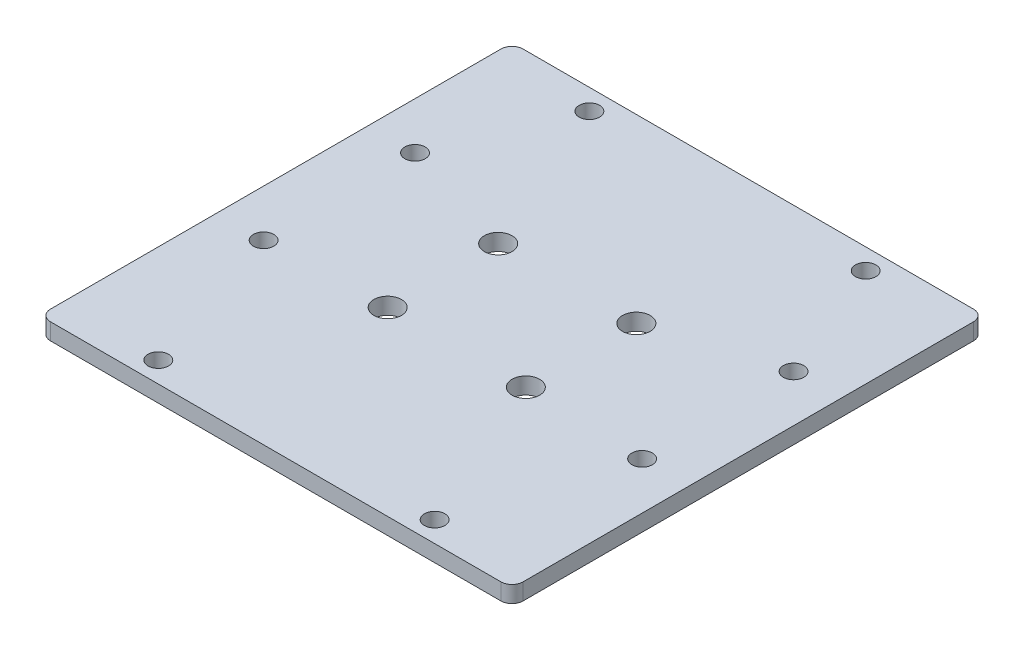
ISO-10303-21;
HEADER;
FILE_DESCRIPTION(('STEP AP214'),'2;1');
FILE_NAME('part.step','',(''),(''),'','','');
FILE_SCHEMA(('AUTOMOTIVE_DESIGN { 1 0 10303 214 1 1 1 1 }'));
ENDSEC;
DATA;
#1=APPLICATION_CONTEXT('core data for automotive mechanical design processes');
#2=APPLICATION_PROTOCOL_DEFINITION('international standard','automotive_design',2000,#1);
#3=PRODUCT_CONTEXT('',#1,'mechanical');
#4=PRODUCT('Part','Part','',(#3));
#5=PRODUCT_RELATED_PRODUCT_CATEGORY('part','',(#4));
#6=PRODUCT_DEFINITION_FORMATION('','',#4);
#7=PRODUCT_DEFINITION_CONTEXT('part definition',#1,'design');
#8=PRODUCT_DEFINITION('design','',#6,#7);
#9=PRODUCT_DEFINITION_SHAPE('','',#8);
#10=(LENGTH_UNIT() NAMED_UNIT(*) SI_UNIT(.MILLI.,.METRE.));
#11=(NAMED_UNIT(*) PLANE_ANGLE_UNIT() SI_UNIT($,.RADIAN.));
#12=(NAMED_UNIT(*) SI_UNIT($,.STERADIAN.) SOLID_ANGLE_UNIT());
#13=UNCERTAINTY_MEASURE_WITH_UNIT(LENGTH_MEASURE(1.E-05),#10,'distance_accuracy_value','');
#14=(GEOMETRIC_REPRESENTATION_CONTEXT(3) GLOBAL_UNCERTAINTY_ASSIGNED_CONTEXT((#13)) GLOBAL_UNIT_ASSIGNED_CONTEXT((#10,
#11,#12)) REPRESENTATION_CONTEXT('',''));
#15=CARTESIAN_POINT('',(0.,0.,0.));
#16=DIRECTION('',(0.,0.,1.));
#17=DIRECTION('',(1.,0.,0.));
#18=AXIS2_PLACEMENT_3D('',#15,#16,#17);
#19=CARTESIAN_POINT('',(-42.75,3.,42.75));
#20=DIRECTION('',(1.,0.,0.));
#21=DIRECTION('',(0.,0.,-1.));
#22=AXIS2_PLACEMENT_3D('',#19,#20,#21);
#23=PLANE('',#22);
#24=DIRECTION('',(0.,0.,1.));
#25=VECTOR('',#24,1.);
#26=CARTESIAN_POINT('',(-42.75,3.,42.75));
#27=LINE('',#26,#25);
#28=CARTESIAN_POINT('',(-42.75,3.,-40.75));
#29=VERTEX_POINT('',#28);
#30=CARTESIAN_POINT('',(-42.75,3.,40.75));
#31=VERTEX_POINT('',#30);
#32=EDGE_CURVE('E124',#29,#31,#27,.T.);
#33=ORIENTED_EDGE('',*,*,#32,.F.);
#34=DIRECTION('',(0.,-1.,0.));
#35=VECTOR('',#34,1.);
#36=CARTESIAN_POINT('',(-42.75,3.,-40.75));
#37=LINE('',#36,#35);
#38=CARTESIAN_POINT('',(-42.75,0.,-40.75));
#39=VERTEX_POINT('',#38);
#40=EDGE_CURVE('E109',#29,#39,#37,.T.);
#41=ORIENTED_EDGE('',*,*,#40,.T.);
#42=DIRECTION('',(0.,0.,1.));
#43=VECTOR('',#42,1.);
#44=CARTESIAN_POINT('',(-42.75,0.,42.75));
#45=LINE('',#44,#43);
#46=CARTESIAN_POINT('',(-42.75,0.,40.75));
#47=VERTEX_POINT('',#46);
#48=EDGE_CURVE('E121',#39,#47,#45,.T.);
#49=ORIENTED_EDGE('',*,*,#48,.T.);
#50=DIRECTION('',(0.,-1.,0.));
#51=VECTOR('',#50,1.);
#52=CARTESIAN_POINT('',(-42.75,3.,40.75));
#53=LINE('',#52,#51);
#54=EDGE_CURVE('E126',#47,#31,#53,.F.);
#55=ORIENTED_EDGE('',*,*,#54,.T.);
#56=EDGE_LOOP('',(#33,#41,#49,#55));
#57=FACE_BOUND('',#56,.T.);
#58=ADVANCED_FACE('F36',(#57),#23,.F.);
#59=CARTESIAN_POINT('',(42.75,3.,42.75));
#60=DIRECTION('',(0.,0.,-1.));
#61=DIRECTION('',(-1.,0.,0.));
#62=AXIS2_PLACEMENT_3D('',#59,#60,#61);
#63=PLANE('',#62);
#64=DIRECTION('',(1.,0.,0.));
#65=VECTOR('',#64,1.);
#66=CARTESIAN_POINT('',(42.75,3.,42.75));
#67=LINE('',#66,#65);
#68=CARTESIAN_POINT('',(-40.75,3.,42.75));
#69=VERTEX_POINT('',#68);
#70=CARTESIAN_POINT('',(40.75,3.,42.75));
#71=VERTEX_POINT('',#70);
#72=EDGE_CURVE('E214',#69,#71,#67,.T.);
#73=ORIENTED_EDGE('',*,*,#72,.F.);
#74=DIRECTION('',(0.,-1.,0.));
#75=VECTOR('',#74,1.);
#76=CARTESIAN_POINT('',(-40.75,3.,42.75));
#77=LINE('',#76,#75);
#78=CARTESIAN_POINT('',(-40.75,0.,42.75));
#79=VERTEX_POINT('',#78);
#80=EDGE_CURVE('E11',#69,#79,#77,.T.);
#81=ORIENTED_EDGE('',*,*,#80,.T.);
#82=DIRECTION('',(1.,0.,0.));
#83=VECTOR('',#82,1.);
#84=CARTESIAN_POINT('',(42.75,0.,42.75));
#85=LINE('',#84,#83);
#86=CARTESIAN_POINT('',(40.75,0.,42.75));
#87=VERTEX_POINT('',#86);
#88=EDGE_CURVE('E131',#79,#87,#85,.T.);
#89=ORIENTED_EDGE('',*,*,#88,.T.);
#90=DIRECTION('',(0.,-1.,0.));
#91=VECTOR('',#90,1.);
#92=CARTESIAN_POINT('',(40.75,3.,42.75));
#93=LINE('',#92,#91);
#94=EDGE_CURVE('E45',#87,#71,#93,.F.);
#95=ORIENTED_EDGE('',*,*,#94,.T.);
#96=EDGE_LOOP('',(#73,#81,#89,#95));
#97=FACE_BOUND('',#96,.T.);
#98=ADVANCED_FACE('F232',(#97),#63,.F.);
#99=CARTESIAN_POINT('',(42.75,3.,42.75));
#100=DIRECTION('',(-1.,0.,0.));
#101=DIRECTION('',(0.,0.,1.));
#102=AXIS2_PLACEMENT_3D('',#99,#100,#101);
#103=PLANE('',#102);
#104=DIRECTION('',(0.,0.,-1.));
#105=VECTOR('',#104,1.);
#106=CARTESIAN_POINT('',(42.75,0.,42.75));
#107=LINE('',#106,#105);
#108=CARTESIAN_POINT('',(42.75,0.,40.75));
#109=VERTEX_POINT('',#108);
#110=CARTESIAN_POINT('',(42.75,0.,-40.75));
#111=VERTEX_POINT('',#110);
#112=EDGE_CURVE('E135',#109,#111,#107,.T.);
#113=ORIENTED_EDGE('',*,*,#112,.T.);
#114=DIRECTION('',(0.,-1.,0.));
#115=VECTOR('',#114,1.);
#116=CARTESIAN_POINT('',(42.75,3.,-40.75));
#117=LINE('',#116,#115);
#118=CARTESIAN_POINT('',(42.75,3.,-40.75));
#119=VERTEX_POINT('',#118);
#120=EDGE_CURVE('E53',#111,#119,#117,.F.);
#121=ORIENTED_EDGE('',*,*,#120,.T.);
#122=DIRECTION('',(0.,0.,-1.));
#123=VECTOR('',#122,1.);
#124=CARTESIAN_POINT('',(42.75,3.,42.75));
#125=LINE('',#124,#123);
#126=CARTESIAN_POINT('',(42.75,3.,40.75));
#127=VERTEX_POINT('',#126);
#128=EDGE_CURVE('E215',#127,#119,#125,.T.);
#129=ORIENTED_EDGE('',*,*,#128,.F.);
#130=DIRECTION('',(0.,-1.,0.));
#131=VECTOR('',#130,1.);
#132=CARTESIAN_POINT('',(42.75,3.,40.75));
#133=LINE('',#132,#131);
#134=EDGE_CURVE('E161',#127,#109,#133,.T.);
#135=ORIENTED_EDGE('',*,*,#134,.T.);
#136=EDGE_LOOP('',(#113,#121,#129,#135));
#137=FACE_BOUND('',#136,.T.);
#138=ADVANCED_FACE('F226',(#137),#103,.F.);
#139=CARTESIAN_POINT('',(42.75,3.,-42.75));
#140=DIRECTION('',(0.,0.,1.));
#141=DIRECTION('',(1.,0.,0.));
#142=AXIS2_PLACEMENT_3D('',#139,#140,#141);
#143=PLANE('',#142);
#144=DIRECTION('',(-1.,0.,0.));
#145=VECTOR('',#144,1.);
#146=CARTESIAN_POINT('',(42.75,0.,-42.75));
#147=LINE('',#146,#145);
#148=CARTESIAN_POINT('',(40.75,0.,-42.75));
#149=VERTEX_POINT('',#148);
#150=CARTESIAN_POINT('',(-40.75,0.,-42.75));
#151=VERTEX_POINT('',#150);
#152=EDGE_CURVE('E145',#149,#151,#147,.T.);
#153=ORIENTED_EDGE('',*,*,#152,.T.);
#154=DIRECTION('',(0.,-1.,0.));
#155=VECTOR('',#154,1.);
#156=CARTESIAN_POINT('',(-40.75,3.,-42.75));
#157=LINE('',#156,#155);
#158=CARTESIAN_POINT('',(-40.75,3.,-42.75));
#159=VERTEX_POINT('',#158);
#160=EDGE_CURVE('E110',#151,#159,#157,.F.);
#161=ORIENTED_EDGE('',*,*,#160,.T.);
#162=DIRECTION('',(-1.,0.,0.));
#163=VECTOR('',#162,1.);
#164=CARTESIAN_POINT('',(42.75,3.,-42.75));
#165=LINE('',#164,#163);
#166=CARTESIAN_POINT('',(40.75,3.,-42.75));
#167=VERTEX_POINT('',#166);
#168=EDGE_CURVE('E141',#167,#159,#165,.T.);
#169=ORIENTED_EDGE('',*,*,#168,.F.);
#170=DIRECTION('',(0.,-1.,0.));
#171=VECTOR('',#170,1.);
#172=CARTESIAN_POINT('',(40.75,3.,-42.75));
#173=LINE('',#172,#171);
#174=EDGE_CURVE('E115',#167,#149,#173,.T.);
#175=ORIENTED_EDGE('',*,*,#174,.T.);
#176=EDGE_LOOP('',(#153,#161,#169,#175));
#177=FACE_BOUND('',#176,.T.);
#178=ADVANCED_FACE('F222',(#177),#143,.F.);
#179=CARTESIAN_POINT('',(0.,3.,0.));
#180=DIRECTION('',(0.,1.,0.));
#181=DIRECTION('',(0.,0.,1.));
#182=AXIS2_PLACEMENT_3D('',#179,#180,#181);
#183=PLANE('',#182);
#184=CARTESIAN_POINT('',(-12.5,3.,-10.));
#185=DIRECTION('',(0.,1.,0.));
#186=DIRECTION('',(0.,0.,1.));
#187=AXIS2_PLACEMENT_3D('',#184,#185,#186);
#188=CIRCLE('',#187,2.5);
#189=CARTESIAN_POINT('',(-12.5,3.,-7.5));
#190=VERTEX_POINT('',#189);
#191=EDGE_CURVE('E493',#190,#190,#188,.T.);
#192=ORIENTED_EDGE('',*,*,#191,.F.);
#193=EDGE_LOOP('',(#192));
#194=FACE_BOUND('',#193,.T.);
#195=CARTESIAN_POINT('',(-12.5,3.,10.));
#196=DIRECTION('',(0.,1.,0.));
#197=DIRECTION('',(0.,0.,1.));
#198=AXIS2_PLACEMENT_3D('',#195,#196,#197);
#199=CIRCLE('',#198,2.5);
#200=CARTESIAN_POINT('',(-12.5,3.,12.5));
#201=VERTEX_POINT('',#200);
#202=EDGE_CURVE('E501',#201,#201,#199,.T.);
#203=ORIENTED_EDGE('',*,*,#202,.F.);
#204=EDGE_LOOP('',(#203));
#205=FACE_BOUND('',#204,.T.);
#206=CARTESIAN_POINT('',(12.5,3.,-10.));
#207=DIRECTION('',(0.,1.,0.));
#208=DIRECTION('',(0.,0.,1.));
#209=AXIS2_PLACEMENT_3D('',#206,#207,#208);
#210=CIRCLE('',#209,2.5);
#211=CARTESIAN_POINT('',(12.5,3.,-7.5));
#212=VERTEX_POINT('',#211);
#213=EDGE_CURVE('E497',#212,#212,#210,.T.);
#214=ORIENTED_EDGE('',*,*,#213,.F.);
#215=EDGE_LOOP('',(#214));
#216=FACE_BOUND('',#215,.T.);
#217=CARTESIAN_POINT('',(12.5,3.,10.));
#218=DIRECTION('',(0.,1.,0.));
#219=DIRECTION('',(0.,0.,1.));
#220=AXIS2_PLACEMENT_3D('',#217,#218,#219);
#221=CIRCLE('',#220,2.5);
#222=CARTESIAN_POINT('',(12.5,3.,12.5));
#223=VERTEX_POINT('',#222);
#224=EDGE_CURVE('E494',#223,#223,#221,.T.);
#225=ORIENTED_EDGE('',*,*,#224,.F.);
#226=EDGE_LOOP('',(#225));
#227=FACE_BOUND('',#226,.T.);
#228=CARTESIAN_POINT('',(-34.25,3.,10.7));
#229=DIRECTION('',(0.,1.,0.));
#230=DIRECTION('',(0.,0.,1.));
#231=AXIS2_PLACEMENT_3D('',#228,#229,#230);
#232=CIRCLE('',#231,1.85);
#233=CARTESIAN_POINT('',(-34.25,3.,12.55));
#234=VERTEX_POINT('',#233);
#235=EDGE_CURVE('E498',#234,#234,#232,.T.);
#236=ORIENTED_EDGE('',*,*,#235,.F.);
#237=EDGE_LOOP('',(#236));
#238=FACE_BOUND('',#237,.T.);
#239=CARTESIAN_POINT('',(34.2499999999999,3.,10.7));
#240=DIRECTION('',(0.,1.,0.));
#241=DIRECTION('',(0.,0.,1.));
#242=AXIS2_PLACEMENT_3D('',#239,#240,#241);
#243=CIRCLE('',#242,1.85);
#244=CARTESIAN_POINT('',(34.2499999999999,3.,12.55));
#245=VERTEX_POINT('',#244);
#246=EDGE_CURVE('E509',#245,#245,#243,.T.);
#247=ORIENTED_EDGE('',*,*,#246,.F.);
#248=EDGE_LOOP('',(#247));
#249=FACE_BOUND('',#248,.T.);
#250=CARTESIAN_POINT('',(34.2499999999999,3.,-16.7));
#251=DIRECTION('',(0.,1.,0.));
#252=DIRECTION('',(0.,0.,1.));
#253=AXIS2_PLACEMENT_3D('',#250,#251,#252);
#254=CIRCLE('',#253,1.85);
#255=CARTESIAN_POINT('',(34.2499999999999,3.,-14.85));
#256=VERTEX_POINT('',#255);
#257=EDGE_CURVE('E506',#256,#256,#254,.T.);
#258=ORIENTED_EDGE('',*,*,#257,.F.);
#259=EDGE_LOOP('',(#258));
#260=FACE_BOUND('',#259,.T.);
#261=CARTESIAN_POINT('',(-34.25,3.,-16.7));
#262=DIRECTION('',(0.,1.,0.));
#263=DIRECTION('',(0.,0.,1.));
#264=AXIS2_PLACEMENT_3D('',#261,#262,#263);
#265=CIRCLE('',#264,1.85);
#266=CARTESIAN_POINT('',(-34.25,3.,-14.85));
#267=VERTEX_POINT('',#266);
#268=EDGE_CURVE('E179',#267,#267,#265,.T.);
#269=ORIENTED_EDGE('',*,*,#268,.F.);
#270=EDGE_LOOP('',(#269));
#271=FACE_BOUND('',#270,.T.);
#272=CARTESIAN_POINT('',(-25.,3.,39.));
#273=DIRECTION('',(0.,1.,0.));
#274=DIRECTION('',(0.,0.,1.));
#275=AXIS2_PLACEMENT_3D('',#272,#273,#274);
#276=CIRCLE('',#275,1.85);
#277=CARTESIAN_POINT('',(-25.,3.,40.85));
#278=VERTEX_POINT('',#277);
#279=EDGE_CURVE('E198',#278,#278,#276,.T.);
#280=ORIENTED_EDGE('',*,*,#279,.F.);
#281=EDGE_LOOP('',(#280));
#282=FACE_BOUND('',#281,.T.);
#283=CARTESIAN_POINT('',(25.,3.,39.));
#284=DIRECTION('',(0.,1.,0.));
#285=DIRECTION('',(0.,0.,1.));
#286=AXIS2_PLACEMENT_3D('',#283,#284,#285);
#287=CIRCLE('',#286,1.85);
#288=CARTESIAN_POINT('',(25.,3.,40.85));
#289=VERTEX_POINT('',#288);
#290=EDGE_CURVE('E202',#289,#289,#287,.T.);
#291=ORIENTED_EDGE('',*,*,#290,.F.);
#292=EDGE_LOOP('',(#291));
#293=FACE_BOUND('',#292,.T.);
#294=CARTESIAN_POINT('',(25.,3.,-39.));
#295=DIRECTION('',(0.,1.,0.));
#296=DIRECTION('',(0.,0.,1.));
#297=AXIS2_PLACEMENT_3D('',#294,#295,#296);
#298=CIRCLE('',#297,1.85);
#299=CARTESIAN_POINT('',(25.,3.,-37.15));
#300=VERTEX_POINT('',#299);
#301=EDGE_CURVE('E207',#300,#300,#298,.T.);
#302=ORIENTED_EDGE('',*,*,#301,.F.);
#303=EDGE_LOOP('',(#302));
#304=FACE_BOUND('',#303,.T.);
#305=CARTESIAN_POINT('',(-25.,3.,-39.));
#306=DIRECTION('',(0.,1.,0.));
#307=DIRECTION('',(0.,0.,1.));
#308=AXIS2_PLACEMENT_3D('',#305,#306,#307);
#309=CIRCLE('',#308,1.85);
#310=CARTESIAN_POINT('',(-25.,3.,-37.15));
#311=VERTEX_POINT('',#310);
#312=EDGE_CURVE('E170',#311,#311,#309,.T.);
#313=ORIENTED_EDGE('',*,*,#312,.F.);
#314=EDGE_LOOP('',(#313));
#315=FACE_BOUND('',#314,.T.);
#316=ORIENTED_EDGE('',*,*,#168,.T.);
#317=CARTESIAN_POINT('',(-40.75,3.,-40.75));
#318=DIRECTION('',(0.,1.,0.));
#319=DIRECTION('',(0.,0.,1.));
#320=AXIS2_PLACEMENT_3D('',#317,#318,#319);
#321=CIRCLE('',#320,2.);
#322=EDGE_CURVE('E159',#159,#29,#321,.T.);
#323=ORIENTED_EDGE('',*,*,#322,.T.);
#324=ORIENTED_EDGE('',*,*,#32,.T.);
#325=CARTESIAN_POINT('',(-40.75,3.,40.75));
#326=DIRECTION('',(0.,1.,0.));
#327=DIRECTION('',(0.,0.,1.));
#328=AXIS2_PLACEMENT_3D('',#325,#326,#327);
#329=CIRCLE('',#328,2.);
#330=EDGE_CURVE('E155',#31,#69,#329,.T.);
#331=ORIENTED_EDGE('',*,*,#330,.T.);
#332=ORIENTED_EDGE('',*,*,#72,.T.);
#333=CARTESIAN_POINT('',(40.75,3.,40.75));
#334=DIRECTION('',(0.,1.,0.));
#335=DIRECTION('',(0.,0.,1.));
#336=AXIS2_PLACEMENT_3D('',#333,#334,#335);
#337=CIRCLE('',#336,2.);
#338=EDGE_CURVE('E60',#71,#127,#337,.T.);
#339=ORIENTED_EDGE('',*,*,#338,.T.);
#340=ORIENTED_EDGE('',*,*,#128,.T.);
#341=CARTESIAN_POINT('',(40.75,3.,-40.75));
#342=DIRECTION('',(0.,1.,0.));
#343=DIRECTION('',(0.,0.,1.));
#344=AXIS2_PLACEMENT_3D('',#341,#342,#343);
#345=CIRCLE('',#344,2.);
#346=EDGE_CURVE('E157',#119,#167,#345,.T.);
#347=ORIENTED_EDGE('',*,*,#346,.T.);
#348=EDGE_LOOP('',(#316,#323,#324,#331,#332,#339,#340,#347));
#349=FACE_BOUND('',#348,.T.);
#350=ADVANCED_FACE('F219',(#194,#205,#216,#227,#238,#249,#260,#271,#282,#293,#304,#315,#349),
#183,.T.);
#351=CARTESIAN_POINT('',(0.,0.,0.));
#352=DIRECTION('',(0.,1.,0.));
#353=DIRECTION('',(0.,0.,1.));
#354=AXIS2_PLACEMENT_3D('',#351,#352,#353);
#355=PLANE('',#354);
#356=CARTESIAN_POINT('',(-12.5,0.,-10.));
#357=DIRECTION('',(0.,1.,0.));
#358=DIRECTION('',(0.,0.,1.));
#359=AXIS2_PLACEMENT_3D('',#356,#357,#358);
#360=CIRCLE('',#359,2.5);
#361=CARTESIAN_POINT('',(-12.5,0.,-7.5));
#362=VERTEX_POINT('',#361);
#363=EDGE_CURVE('E40',#362,#362,#360,.T.);
#364=ORIENTED_EDGE('',*,*,#363,.T.);
#365=EDGE_LOOP('',(#364));
#366=FACE_BOUND('',#365,.T.);
#367=CARTESIAN_POINT('',(-12.5,0.,10.));
#368=DIRECTION('',(0.,1.,0.));
#369=DIRECTION('',(0.,0.,1.));
#370=AXIS2_PLACEMENT_3D('',#367,#368,#369);
#371=CIRCLE('',#370,2.5);
#372=CARTESIAN_POINT('',(-12.5,0.,12.5));
#373=VERTEX_POINT('',#372);
#374=EDGE_CURVE('E193',#373,#373,#371,.T.);
#375=ORIENTED_EDGE('',*,*,#374,.T.);
#376=EDGE_LOOP('',(#375));
#377=FACE_BOUND('',#376,.T.);
#378=CARTESIAN_POINT('',(12.5,0.,-10.));
#379=DIRECTION('',(0.,1.,0.));
#380=DIRECTION('',(0.,0.,1.));
#381=AXIS2_PLACEMENT_3D('',#378,#379,#380);
#382=CIRCLE('',#381,2.5);
#383=CARTESIAN_POINT('',(12.5,0.,-7.5));
#384=VERTEX_POINT('',#383);
#385=EDGE_CURVE('E191',#384,#384,#382,.T.);
#386=ORIENTED_EDGE('',*,*,#385,.T.);
#387=EDGE_LOOP('',(#386));
#388=FACE_BOUND('',#387,.T.);
#389=CARTESIAN_POINT('',(12.5,0.,10.));
#390=DIRECTION('',(0.,1.,0.));
#391=DIRECTION('',(0.,0.,1.));
#392=AXIS2_PLACEMENT_3D('',#389,#390,#391);
#393=CIRCLE('',#392,2.5);
#394=CARTESIAN_POINT('',(12.5,0.,12.5));
#395=VERTEX_POINT('',#394);
#396=EDGE_CURVE('E188',#395,#395,#393,.T.);
#397=ORIENTED_EDGE('',*,*,#396,.T.);
#398=EDGE_LOOP('',(#397));
#399=FACE_BOUND('',#398,.T.);
#400=CARTESIAN_POINT('',(-34.25,0.,10.7));
#401=DIRECTION('',(0.,1.,0.));
#402=DIRECTION('',(0.,0.,1.));
#403=AXIS2_PLACEMENT_3D('',#400,#401,#402);
#404=CIRCLE('',#403,1.85);
#405=CARTESIAN_POINT('',(-34.25,0.,12.55));
#406=VERTEX_POINT('',#405);
#407=EDGE_CURVE('E185',#406,#406,#404,.T.);
#408=ORIENTED_EDGE('',*,*,#407,.T.);
#409=EDGE_LOOP('',(#408));
#410=FACE_BOUND('',#409,.T.);
#411=CARTESIAN_POINT('',(34.2499999999999,0.,10.7));
#412=DIRECTION('',(0.,1.,0.));
#413=DIRECTION('',(0.,0.,1.));
#414=AXIS2_PLACEMENT_3D('',#411,#412,#413);
#415=CIRCLE('',#414,1.85);
#416=CARTESIAN_POINT('',(34.2499999999999,0.,12.55));
#417=VERTEX_POINT('',#416);
#418=EDGE_CURVE('E182',#417,#417,#415,.T.);
#419=ORIENTED_EDGE('',*,*,#418,.T.);
#420=EDGE_LOOP('',(#419));
#421=FACE_BOUND('',#420,.T.);
#422=CARTESIAN_POINT('',(34.2499999999999,0.,-16.7));
#423=DIRECTION('',(0.,1.,0.));
#424=DIRECTION('',(0.,0.,1.));
#425=AXIS2_PLACEMENT_3D('',#422,#423,#424);
#426=CIRCLE('',#425,1.85);
#427=CARTESIAN_POINT('',(34.2499999999999,0.,-14.85));
#428=VERTEX_POINT('',#427);
#429=EDGE_CURVE('E178',#428,#428,#426,.T.);
#430=ORIENTED_EDGE('',*,*,#429,.T.);
#431=EDGE_LOOP('',(#430));
#432=FACE_BOUND('',#431,.T.);
#433=CARTESIAN_POINT('',(-34.25,0.,-16.7));
#434=DIRECTION('',(0.,1.,0.));
#435=DIRECTION('',(0.,0.,1.));
#436=AXIS2_PLACEMENT_3D('',#433,#434,#435);
#437=CIRCLE('',#436,1.85);
#438=CARTESIAN_POINT('',(-34.25,0.,-14.85));
#439=VERTEX_POINT('',#438);
#440=EDGE_CURVE('E175',#439,#439,#437,.T.);
#441=ORIENTED_EDGE('',*,*,#440,.T.);
#442=EDGE_LOOP('',(#441));
#443=FACE_BOUND('',#442,.T.);
#444=CARTESIAN_POINT('',(-25.,0.,39.));
#445=DIRECTION('',(0.,1.,0.));
#446=DIRECTION('',(0.,0.,1.));
#447=AXIS2_PLACEMENT_3D('',#444,#445,#446);
#448=CIRCLE('',#447,1.85);
#449=CARTESIAN_POINT('',(-25.,0.,40.85));
#450=VERTEX_POINT('',#449);
#451=EDGE_CURVE('E132',#450,#450,#448,.T.);
#452=ORIENTED_EDGE('',*,*,#451,.T.);
#453=EDGE_LOOP('',(#452));
#454=FACE_BOUND('',#453,.T.);
#455=CARTESIAN_POINT('',(25.,0.,39.));
#456=DIRECTION('',(0.,1.,0.));
#457=DIRECTION('',(0.,0.,1.));
#458=AXIS2_PLACEMENT_3D('',#455,#456,#457);
#459=CIRCLE('',#458,1.85);
#460=CARTESIAN_POINT('',(25.,0.,40.85));
#461=VERTEX_POINT('',#460);
#462=EDGE_CURVE('E138',#461,#461,#459,.T.);
#463=ORIENTED_EDGE('',*,*,#462,.T.);
#464=EDGE_LOOP('',(#463));
#465=FACE_BOUND('',#464,.T.);
#466=CARTESIAN_POINT('',(25.,0.,-39.));
#467=DIRECTION('',(0.,1.,0.));
#468=DIRECTION('',(0.,0.,1.));
#469=AXIS2_PLACEMENT_3D('',#466,#467,#468);
#470=CIRCLE('',#469,1.85);
#471=CARTESIAN_POINT('',(25.,0.,-37.15));
#472=VERTEX_POINT('',#471);
#473=EDGE_CURVE('E169',#472,#472,#470,.T.);
#474=ORIENTED_EDGE('',*,*,#473,.T.);
#475=EDGE_LOOP('',(#474));
#476=FACE_BOUND('',#475,.T.);
#477=CARTESIAN_POINT('',(-25.,0.,-39.));
#478=DIRECTION('',(0.,1.,0.));
#479=DIRECTION('',(0.,0.,1.));
#480=AXIS2_PLACEMENT_3D('',#477,#478,#479);
#481=CIRCLE('',#480,1.85);
#482=CARTESIAN_POINT('',(-25.,0.,-37.15));
#483=VERTEX_POINT('',#482);
#484=EDGE_CURVE('E166',#483,#483,#481,.T.);
#485=ORIENTED_EDGE('',*,*,#484,.T.);
#486=EDGE_LOOP('',(#485));
#487=FACE_BOUND('',#486,.T.);
#488=ORIENTED_EDGE('',*,*,#48,.F.);
#489=CARTESIAN_POINT('',(-40.75,0.,-40.75));
#490=DIRECTION('',(0.,1.,0.));
#491=DIRECTION('',(0.,0.,1.));
#492=AXIS2_PLACEMENT_3D('',#489,#490,#491);
#493=CIRCLE('',#492,2.);
#494=EDGE_CURVE('E105',#39,#151,#493,.F.);
#495=ORIENTED_EDGE('',*,*,#494,.T.);
#496=ORIENTED_EDGE('',*,*,#152,.F.);
#497=CARTESIAN_POINT('',(40.75,0.,-40.75));
#498=DIRECTION('',(0.,1.,0.));
#499=DIRECTION('',(0.,0.,1.));
#500=AXIS2_PLACEMENT_3D('',#497,#498,#499);
#501=CIRCLE('',#500,2.);
#502=EDGE_CURVE('E116',#149,#111,#501,.F.);
#503=ORIENTED_EDGE('',*,*,#502,.T.);
#504=ORIENTED_EDGE('',*,*,#112,.F.);
#505=CARTESIAN_POINT('',(40.75,0.,40.75));
#506=DIRECTION('',(0.,1.,0.));
#507=DIRECTION('',(0.,0.,1.));
#508=AXIS2_PLACEMENT_3D('',#505,#506,#507);
#509=CIRCLE('',#508,2.);
#510=EDGE_CURVE('E125',#109,#87,#509,.F.);
#511=ORIENTED_EDGE('',*,*,#510,.T.);
#512=ORIENTED_EDGE('',*,*,#88,.F.);
#513=CARTESIAN_POINT('',(-40.75,0.,40.75));
#514=DIRECTION('',(0.,1.,0.));
#515=DIRECTION('',(0.,0.,1.));
#516=AXIS2_PLACEMENT_3D('',#513,#514,#515);
#517=CIRCLE('',#516,2.);
#518=EDGE_CURVE('E130',#79,#47,#517,.F.);
#519=ORIENTED_EDGE('',*,*,#518,.T.);
#520=EDGE_LOOP('',(#488,#495,#496,#503,#504,#511,#512,#519));
#521=FACE_BOUND('',#520,.T.);
#522=ADVANCED_FACE('F128',(#366,#377,#388,#399,#410,#421,#432,#443,#454,#465,#476,#487,#521),
#355,.F.);
#523=CARTESIAN_POINT('',(-40.75,3.,-40.75));
#524=DIRECTION('',(0.,-1.,0.));
#525=DIRECTION('',(0.,0.,-1.));
#526=AXIS2_PLACEMENT_3D('',#523,#524,#525);
#527=CYLINDRICAL_SURFACE('',#526,2.);
#528=ORIENTED_EDGE('',*,*,#322,.F.);
#529=ORIENTED_EDGE('',*,*,#160,.F.);
#530=ORIENTED_EDGE('',*,*,#494,.F.);
#531=ORIENTED_EDGE('',*,*,#40,.F.);
#532=EDGE_LOOP('',(#528,#529,#530,#531));
#533=FACE_BOUND('',#532,.T.);
#534=ADVANCED_FACE('F108',(#533),#527,.T.);
#535=CARTESIAN_POINT('',(40.75,3.,-40.75));
#536=DIRECTION('',(0.,-1.,0.));
#537=DIRECTION('',(0.,0.,-1.));
#538=AXIS2_PLACEMENT_3D('',#535,#536,#537);
#539=CYLINDRICAL_SURFACE('',#538,2.);
#540=ORIENTED_EDGE('',*,*,#346,.F.);
#541=ORIENTED_EDGE('',*,*,#120,.F.);
#542=ORIENTED_EDGE('',*,*,#502,.F.);
#543=ORIENTED_EDGE('',*,*,#174,.F.);
#544=EDGE_LOOP('',(#540,#541,#542,#543));
#545=FACE_BOUND('',#544,.T.);
#546=ADVANCED_FACE('F224',(#545),#539,.T.);
#547=CARTESIAN_POINT('',(-40.75,3.,40.75));
#548=DIRECTION('',(0.,-1.,0.));
#549=DIRECTION('',(0.,0.,-1.));
#550=AXIS2_PLACEMENT_3D('',#547,#548,#549);
#551=CYLINDRICAL_SURFACE('',#550,2.);
#552=ORIENTED_EDGE('',*,*,#330,.F.);
#553=ORIENTED_EDGE('',*,*,#54,.F.);
#554=ORIENTED_EDGE('',*,*,#518,.F.);
#555=ORIENTED_EDGE('',*,*,#80,.F.);
#556=EDGE_LOOP('',(#552,#553,#554,#555));
#557=FACE_BOUND('',#556,.T.);
#558=ADVANCED_FACE('F236',(#557),#551,.T.);
#559=CARTESIAN_POINT('',(40.75,3.,40.75));
#560=DIRECTION('',(0.,-1.,0.));
#561=DIRECTION('',(0.,0.,-1.));
#562=AXIS2_PLACEMENT_3D('',#559,#560,#561);
#563=CYLINDRICAL_SURFACE('',#562,2.);
#564=ORIENTED_EDGE('',*,*,#338,.F.);
#565=ORIENTED_EDGE('',*,*,#94,.F.);
#566=ORIENTED_EDGE('',*,*,#510,.F.);
#567=ORIENTED_EDGE('',*,*,#134,.F.);
#568=EDGE_LOOP('',(#564,#565,#566,#567));
#569=FACE_BOUND('',#568,.T.);
#570=ADVANCED_FACE('F38',(#569),#563,.T.);
#571=CARTESIAN_POINT('',(-25.,-7.,-39.));
#572=DIRECTION('',(0.,1.,0.));
#573=DIRECTION('',(0.,0.,1.));
#574=AXIS2_PLACEMENT_3D('',#571,#572,#573);
#575=CYLINDRICAL_SURFACE('',#574,1.85);
#576=ORIENTED_EDGE('',*,*,#312,.T.);
#577=EDGE_LOOP('',(#576));
#578=FACE_BOUND('',#577,.T.);
#579=ORIENTED_EDGE('',*,*,#484,.F.);
#580=EDGE_LOOP('',(#579));
#581=FACE_BOUND('',#580,.T.);
#582=ADVANCED_FACE('F242',(#578,#581),#575,.F.);
#583=CARTESIAN_POINT('',(25.,-7.,-39.));
#584=DIRECTION('',(0.,1.,0.));
#585=DIRECTION('',(0.,0.,1.));
#586=AXIS2_PLACEMENT_3D('',#583,#584,#585);
#587=CYLINDRICAL_SURFACE('',#586,1.85);
#588=ORIENTED_EDGE('',*,*,#301,.T.);
#589=EDGE_LOOP('',(#588));
#590=FACE_BOUND('',#589,.T.);
#591=ORIENTED_EDGE('',*,*,#473,.F.);
#592=EDGE_LOOP('',(#591));
#593=FACE_BOUND('',#592,.T.);
#594=ADVANCED_FACE('F402',(#590,#593),#587,.F.);
#595=CARTESIAN_POINT('',(25.,-7.,39.));
#596=DIRECTION('',(0.,1.,0.));
#597=DIRECTION('',(0.,0.,1.));
#598=AXIS2_PLACEMENT_3D('',#595,#596,#597);
#599=CYLINDRICAL_SURFACE('',#598,1.85);
#600=ORIENTED_EDGE('',*,*,#290,.T.);
#601=EDGE_LOOP('',(#600));
#602=FACE_BOUND('',#601,.T.);
#603=ORIENTED_EDGE('',*,*,#462,.F.);
#604=EDGE_LOOP('',(#603));
#605=FACE_BOUND('',#604,.T.);
#606=ADVANCED_FACE('F394',(#602,#605),#599,.F.);
#607=CARTESIAN_POINT('',(-25.,-7.,39.));
#608=DIRECTION('',(0.,1.,0.));
#609=DIRECTION('',(0.,0.,1.));
#610=AXIS2_PLACEMENT_3D('',#607,#608,#609);
#611=CYLINDRICAL_SURFACE('',#610,1.85);
#612=ORIENTED_EDGE('',*,*,#279,.T.);
#613=EDGE_LOOP('',(#612));
#614=FACE_BOUND('',#613,.T.);
#615=ORIENTED_EDGE('',*,*,#451,.F.);
#616=EDGE_LOOP('',(#615));
#617=FACE_BOUND('',#616,.T.);
#618=ADVANCED_FACE('F285',(#614,#617),#611,.F.);
#619=CARTESIAN_POINT('',(-34.25,-7.,-16.7));
#620=DIRECTION('',(0.,1.,0.));
#621=DIRECTION('',(0.,0.,1.));
#622=AXIS2_PLACEMENT_3D('',#619,#620,#621);
#623=CYLINDRICAL_SURFACE('',#622,1.85);
#624=ORIENTED_EDGE('',*,*,#268,.T.);
#625=EDGE_LOOP('',(#624));
#626=FACE_BOUND('',#625,.T.);
#627=ORIENTED_EDGE('',*,*,#440,.F.);
#628=EDGE_LOOP('',(#627));
#629=FACE_BOUND('',#628,.T.);
#630=ADVANCED_FACE('F296',(#626,#629),#623,.F.);
#631=CARTESIAN_POINT('',(34.2499999999999,-7.,-16.7));
#632=DIRECTION('',(0.,1.,0.));
#633=DIRECTION('',(0.,0.,1.));
#634=AXIS2_PLACEMENT_3D('',#631,#632,#633);
#635=CYLINDRICAL_SURFACE('',#634,1.85);
#636=ORIENTED_EDGE('',*,*,#257,.T.);
#637=EDGE_LOOP('',(#636));
#638=FACE_BOUND('',#637,.T.);
#639=ORIENTED_EDGE('',*,*,#429,.F.);
#640=EDGE_LOOP('',(#639));
#641=FACE_BOUND('',#640,.T.);
#642=ADVANCED_FACE('F301',(#638,#641),#635,.F.);
#643=CARTESIAN_POINT('',(34.2499999999999,-7.,10.7));
#644=DIRECTION('',(0.,1.,0.));
#645=DIRECTION('',(0.,0.,1.));
#646=AXIS2_PLACEMENT_3D('',#643,#644,#645);
#647=CYLINDRICAL_SURFACE('',#646,1.85);
#648=ORIENTED_EDGE('',*,*,#246,.T.);
#649=EDGE_LOOP('',(#648));
#650=FACE_BOUND('',#649,.T.);
#651=ORIENTED_EDGE('',*,*,#418,.F.);
#652=EDGE_LOOP('',(#651));
#653=FACE_BOUND('',#652,.T.);
#654=ADVANCED_FACE('F312',(#650,#653),#647,.F.);
#655=CARTESIAN_POINT('',(-34.25,-7.,10.7));
#656=DIRECTION('',(0.,1.,0.));
#657=DIRECTION('',(0.,0.,1.));
#658=AXIS2_PLACEMENT_3D('',#655,#656,#657);
#659=CYLINDRICAL_SURFACE('',#658,1.85);
#660=ORIENTED_EDGE('',*,*,#235,.T.);
#661=EDGE_LOOP('',(#660));
#662=FACE_BOUND('',#661,.T.);
#663=ORIENTED_EDGE('',*,*,#407,.F.);
#664=EDGE_LOOP('',(#663));
#665=FACE_BOUND('',#664,.T.);
#666=ADVANCED_FACE('F323',(#662,#665),#659,.F.);
#667=CARTESIAN_POINT('',(12.5,-7.,10.));
#668=DIRECTION('',(0.,1.,0.));
#669=DIRECTION('',(0.,0.,1.));
#670=AXIS2_PLACEMENT_3D('',#667,#668,#669);
#671=CYLINDRICAL_SURFACE('',#670,2.5);
#672=ORIENTED_EDGE('',*,*,#224,.T.);
#673=EDGE_LOOP('',(#672));
#674=FACE_BOUND('',#673,.T.);
#675=ORIENTED_EDGE('',*,*,#396,.F.);
#676=EDGE_LOOP('',(#675));
#677=FACE_BOUND('',#676,.T.);
#678=ADVANCED_FACE('F334',(#674,#677),#671,.F.);
#679=CARTESIAN_POINT('',(12.5,-7.,-10.));
#680=DIRECTION('',(0.,1.,0.));
#681=DIRECTION('',(0.,0.,1.));
#682=AXIS2_PLACEMENT_3D('',#679,#680,#681);
#683=CYLINDRICAL_SURFACE('',#682,2.5);
#684=ORIENTED_EDGE('',*,*,#213,.T.);
#685=EDGE_LOOP('',(#684));
#686=FACE_BOUND('',#685,.T.);
#687=ORIENTED_EDGE('',*,*,#385,.F.);
#688=EDGE_LOOP('',(#687));
#689=FACE_BOUND('',#688,.T.);
#690=ADVANCED_FACE('F345',(#686,#689),#683,.F.);
#691=CARTESIAN_POINT('',(-12.5,-7.,10.));
#692=DIRECTION('',(0.,1.,0.));
#693=DIRECTION('',(0.,0.,1.));
#694=AXIS2_PLACEMENT_3D('',#691,#692,#693);
#695=CYLINDRICAL_SURFACE('',#694,2.5);
#696=ORIENTED_EDGE('',*,*,#202,.T.);
#697=EDGE_LOOP('',(#696));
#698=FACE_BOUND('',#697,.T.);
#699=ORIENTED_EDGE('',*,*,#374,.F.);
#700=EDGE_LOOP('',(#699));
#701=FACE_BOUND('',#700,.T.);
#702=ADVANCED_FACE('F356',(#698,#701),#695,.F.);
#703=CARTESIAN_POINT('',(-12.5,-7.,-10.));
#704=DIRECTION('',(0.,1.,0.));
#705=DIRECTION('',(0.,0.,1.));
#706=AXIS2_PLACEMENT_3D('',#703,#704,#705);
#707=CYLINDRICAL_SURFACE('',#706,2.5);
#708=ORIENTED_EDGE('',*,*,#191,.T.);
#709=EDGE_LOOP('',(#708));
#710=FACE_BOUND('',#709,.T.);
#711=ORIENTED_EDGE('',*,*,#363,.F.);
#712=EDGE_LOOP('',(#711));
#713=FACE_BOUND('',#712,.T.);
#714=ADVANCED_FACE('F367',(#710,#713),#707,.F.);
#715=CLOSED_SHELL('',(#58,#98,#138,#178,#350,#522,#534,#546,#558,#570,#582,#594,#606,#618,#630,
#642,#654,#666,#678,#690,#702,#714));
#716=MANIFOLD_SOLID_BREP('B2',#715);
#717=ADVANCED_BREP_SHAPE_REPRESENTATION('',(#18,#716),#14);
#718=SHAPE_DEFINITION_REPRESENTATION(#9,#717);
ENDSEC;
END-ISO-10303-21;
